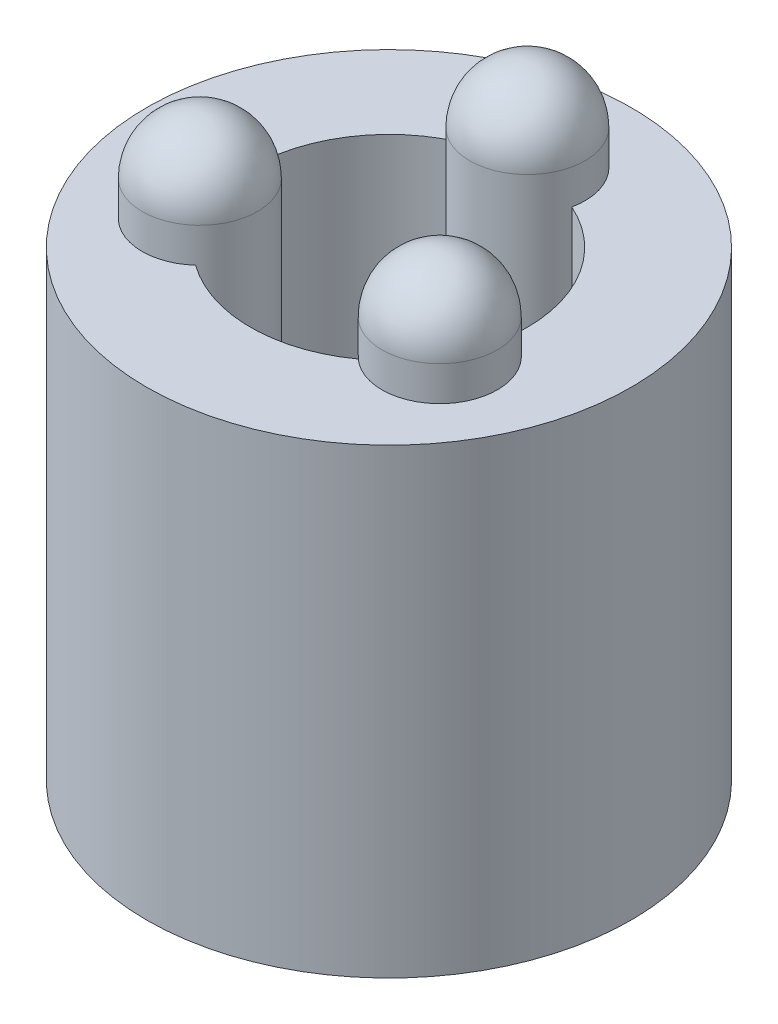
ISO-10303-21;
HEADER;
FILE_DESCRIPTION(('STEP AP214'),'2;1');
FILE_NAME('part.step','',(''),(''),'','','');
FILE_SCHEMA(('AUTOMOTIVE_DESIGN { 1 0 10303 214 1 1 1 1 }'));
ENDSEC;
DATA;
#1=APPLICATION_CONTEXT('core data for automotive mechanical design processes');
#2=APPLICATION_PROTOCOL_DEFINITION('international standard','automotive_design',2000,#1);
#3=PRODUCT_CONTEXT('',#1,'mechanical');
#4=PRODUCT('Part','Part','',(#3));
#5=PRODUCT_RELATED_PRODUCT_CATEGORY('part','',(#4));
#6=PRODUCT_DEFINITION_FORMATION('','',#4);
#7=PRODUCT_DEFINITION_CONTEXT('part definition',#1,'design');
#8=PRODUCT_DEFINITION('design','',#6,#7);
#9=PRODUCT_DEFINITION_SHAPE('','',#8);
#10=(LENGTH_UNIT() NAMED_UNIT(*) SI_UNIT(.MILLI.,.METRE.));
#11=(NAMED_UNIT(*) PLANE_ANGLE_UNIT() SI_UNIT($,.RADIAN.));
#12=(NAMED_UNIT(*) SI_UNIT($,.STERADIAN.) SOLID_ANGLE_UNIT());
#13=UNCERTAINTY_MEASURE_WITH_UNIT(LENGTH_MEASURE(1.E-05),#10,'distance_accuracy_value','');
#14=(GEOMETRIC_REPRESENTATION_CONTEXT(3) GLOBAL_UNCERTAINTY_ASSIGNED_CONTEXT((#13)) GLOBAL_UNIT_ASSIGNED_CONTEXT((#10,
#11,#12)) REPRESENTATION_CONTEXT('',''));
#15=CARTESIAN_POINT('',(0.,0.,0.));
#16=DIRECTION('',(0.,0.,1.));
#17=DIRECTION('',(1.,0.,0.));
#18=AXIS2_PLACEMENT_3D('',#15,#16,#17);
#19=CARTESIAN_POINT('',(0.,0.,0.));
#20=DIRECTION('',(0.,1.,0.));
#21=DIRECTION('',(0.,0.,1.));
#22=AXIS2_PLACEMENT_3D('',#19,#20,#21);
#23=CYLINDRICAL_SURFACE('',#22,3.);
#24=CARTESIAN_POINT('',(0.,0.,0.));
#25=DIRECTION('',(0.,1.,0.));
#26=DIRECTION('',(0.,0.,1.));
#27=AXIS2_PLACEMENT_3D('',#24,#25,#26);
#28=CIRCLE('',#27,3.);
#29=CARTESIAN_POINT('',(-1.75989861987443,0.,2.42955898215377));
#30=VERTEX_POINT('',#29);
#31=CARTESIAN_POINT('',(1.76262585540732,0.,2.42758111993186));
#32=VERTEX_POINT('',#31);
#33=EDGE_CURVE('E116',#30,#32,#28,.T.);
#34=ORIENTED_EDGE('',*,*,#33,.F.);
#35=DIRECTION('',(0.,1.,0.));
#36=VECTOR('',#35,1.);
#37=CARTESIAN_POINT('',(-1.75989861987443,6.,2.42955898215377));
#38=LINE('',#37,#36);
#39=CARTESIAN_POINT('',(-1.75989861987443,10.,2.42955898215377));
#40=VERTEX_POINT('',#39);
#41=EDGE_CURVE('E96',#30,#40,#38,.T.);
#42=ORIENTED_EDGE('',*,*,#41,.T.);
#43=CARTESIAN_POINT('',(0.,10.,0.));
#44=DIRECTION('',(0.,1.,0.));
#45=DIRECTION('',(0.,0.,1.));
#46=AXIS2_PLACEMENT_3D('',#43,#44,#45);
#47=CIRCLE('',#46,3.);
#48=CARTESIAN_POINT('',(1.76262585540732,10.,2.42758111993186));
#49=VERTEX_POINT('',#48);
#50=EDGE_CURVE('E125',#40,#49,#47,.T.);
#51=ORIENTED_EDGE('',*,*,#50,.T.);
#52=DIRECTION('',(0.,1.,0.));
#53=VECTOR('',#52,1.);
#54=CARTESIAN_POINT('',(1.76262585540732,6.,2.42758111993186));
#55=LINE('',#54,#53);
#56=EDGE_CURVE('E153',#49,#32,#55,.F.);
#57=ORIENTED_EDGE('',*,*,#56,.T.);
#58=EDGE_LOOP('',(#34,#42,#51,#57));
#59=FACE_BOUND('',#58,.T.);
#60=ADVANCED_FACE('F41',(#59),#23,.F.);
#61=CARTESIAN_POINT('',(2.98397095423433,0.,0.309705253888073));
#62=VERTEX_POINT('',#61);
#63=CARTESIAN_POINT('',(1.22257235357349,0.,-2.73958333333333));
#64=VERTEX_POINT('',#63);
#65=EDGE_CURVE('E118',#62,#64,#28,.T.);
#66=ORIENTED_EDGE('',*,*,#65,.F.);
#67=DIRECTION('',(0.,1.,0.));
#68=VECTOR('',#67,1.);
#69=CARTESIAN_POINT('',(2.98397095423433,6.,0.309705253888073));
#70=LINE('',#69,#68);
#71=CARTESIAN_POINT('',(2.98397095423433,10.,0.309705253888073));
#72=VERTEX_POINT('',#71);
#73=EDGE_CURVE('E108',#62,#72,#70,.T.);
#74=ORIENTED_EDGE('',*,*,#73,.T.);
#75=CARTESIAN_POINT('',(1.22257235357349,10.,-2.73958333333333));
#76=VERTEX_POINT('',#75);
#77=EDGE_CURVE('E126',#72,#76,#47,.T.);
#78=ORIENTED_EDGE('',*,*,#77,.T.);
#79=DIRECTION('',(0.,1.,0.));
#80=VECTOR('',#79,1.);
#81=CARTESIAN_POINT('',(1.22257235357349,6.,-2.73958333333333));
#82=LINE('',#81,#80);
#83=EDGE_CURVE('E203',#76,#64,#82,.F.);
#84=ORIENTED_EDGE('',*,*,#83,.T.);
#85=EDGE_LOOP('',(#66,#74,#78,#84));
#86=FACE_BOUND('',#85,.T.);
#87=ADVANCED_FACE('F154',(#86),#23,.F.);
#88=CARTESIAN_POINT('',(0.,10.,0.));
#89=DIRECTION('',(0.,-1.,0.));
#90=DIRECTION('',(0.,0.,-1.));
#91=AXIS2_PLACEMENT_3D('',#88,#89,#90);
#92=CYLINDRICAL_SURFACE('',#91,5.25);
#93=CARTESIAN_POINT('',(0.,10.,0.));
#94=DIRECTION('',(0.,1.,0.));
#95=DIRECTION('',(0.,0.,1.));
#96=AXIS2_PLACEMENT_3D('',#93,#94,#95);
#97=CIRCLE('',#96,5.25);
#98=CARTESIAN_POINT('',(0.,10.,5.25));
#99=VERTEX_POINT('',#98);
#100=EDGE_CURVE('E120',#99,#99,#97,.T.);
#101=ORIENTED_EDGE('',*,*,#100,.F.);
#102=EDGE_LOOP('',(#101));
#103=FACE_BOUND('',#102,.T.);
#104=CARTESIAN_POINT('',(0.,0.,0.));
#105=DIRECTION('',(0.,1.,0.));
#106=DIRECTION('',(0.,0.,1.));
#107=AXIS2_PLACEMENT_3D('',#104,#105,#106);
#108=CIRCLE('',#107,5.25);
#109=CARTESIAN_POINT('',(0.,0.,5.25));
#110=VERTEX_POINT('',#109);
#111=EDGE_CURVE('E115',#110,#110,#108,.T.);
#112=ORIENTED_EDGE('',*,*,#111,.T.);
#113=EDGE_LOOP('',(#112));
#114=FACE_BOUND('',#113,.T.);
#115=ADVANCED_FACE('F181',(#103,#114),#92,.T.);
#116=CARTESIAN_POINT('',(0.,10.,0.));
#117=DIRECTION('',(0.,1.,0.));
#118=DIRECTION('',(0.,0.,1.));
#119=AXIS2_PLACEMENT_3D('',#116,#117,#118);
#120=PLANE('',#119);
#121=CARTESIAN_POINT('',(-2.59657621135333,10.,1.50086602540376));
#122=DIRECTION('',(0.,1.,0.));
#123=DIRECTION('',(0.,0.,1.));
#124=AXIS2_PLACEMENT_3D('',#121,#122,#123);
#125=CIRCLE('',#124,1.25);
#126=CARTESIAN_POINT('',(-2.98369818894086,10.,0.31232213708128));
#127=VERTEX_POINT('',#126);
#128=EDGE_CURVE('E98',#127,#40,#125,.T.);
#129=ORIENTED_EDGE('',*,*,#128,.F.);
#130=CARTESIAN_POINT('',(-1.22257235357349,10.,-2.73958333333333));
#131=VERTEX_POINT('',#130);
#132=EDGE_CURVE('E107',#131,#127,#47,.T.);
#133=ORIENTED_EDGE('',*,*,#132,.F.);
#134=CARTESIAN_POINT('',(0.,10.,-3.));
#135=DIRECTION('',(0.,1.,0.));
#136=DIRECTION('',(0.,0.,1.));
#137=AXIS2_PLACEMENT_3D('',#134,#135,#136);
#138=CIRCLE('',#137,1.25);
#139=EDGE_CURVE('E128',#76,#131,#138,.T.);
#140=ORIENTED_EDGE('',*,*,#139,.F.);
#141=ORIENTED_EDGE('',*,*,#77,.F.);
#142=CARTESIAN_POINT('',(2.59957621135331,10.,1.49913397459623));
#143=DIRECTION('',(0.,1.,0.));
#144=DIRECTION('',(0.,0.,1.));
#145=AXIS2_PLACEMENT_3D('',#142,#143,#144);
#146=CIRCLE('',#145,1.25);
#147=EDGE_CURVE('E136',#49,#72,#146,.T.);
#148=ORIENTED_EDGE('',*,*,#147,.F.);
#149=ORIENTED_EDGE('',*,*,#50,.F.);
#150=EDGE_LOOP('',(#129,#133,#140,#141,#148,#149));
#151=FACE_BOUND('',#150,.T.);
#152=ORIENTED_EDGE('',*,*,#100,.T.);
#153=EDGE_LOOP('',(#152));
#154=FACE_BOUND('',#153,.T.);
#155=ADVANCED_FACE('F149',(#151,#154),#120,.T.);
#156=CARTESIAN_POINT('',(0.,0.,0.));
#157=DIRECTION('',(0.,1.,0.));
#158=DIRECTION('',(0.,0.,1.));
#159=AXIS2_PLACEMENT_3D('',#156,#157,#158);
#160=PLANE('',#159);
#161=CARTESIAN_POINT('',(-1.22257235357349,0.,-2.73958333333333));
#162=VERTEX_POINT('',#161);
#163=CARTESIAN_POINT('',(-2.98369818894086,0.,0.312322137081281));
#164=VERTEX_POINT('',#163);
#165=EDGE_CURVE('E105',#162,#164,#28,.T.);
#166=ORIENTED_EDGE('',*,*,#165,.T.);
#167=CARTESIAN_POINT('',(-2.59657621135333,0.,1.50086602540376));
#168=DIRECTION('',(0.,1.,0.));
#169=DIRECTION('',(0.,0.,1.));
#170=AXIS2_PLACEMENT_3D('',#167,#168,#169);
#171=CIRCLE('',#170,1.25);
#172=EDGE_CURVE('E56',#30,#164,#171,.T.);
#173=ORIENTED_EDGE('',*,*,#172,.F.);
#174=ORIENTED_EDGE('',*,*,#33,.T.);
#175=CARTESIAN_POINT('',(2.59957621135331,0.,1.49913397459623));
#176=DIRECTION('',(0.,1.,0.));
#177=DIRECTION('',(0.,0.,1.));
#178=AXIS2_PLACEMENT_3D('',#175,#176,#177);
#179=CIRCLE('',#178,1.25);
#180=EDGE_CURVE('E62',#62,#32,#179,.T.);
#181=ORIENTED_EDGE('',*,*,#180,.F.);
#182=ORIENTED_EDGE('',*,*,#65,.T.);
#183=CARTESIAN_POINT('',(0.,0.,-3.));
#184=DIRECTION('',(0.,1.,0.));
#185=DIRECTION('',(0.,0.,1.));
#186=AXIS2_PLACEMENT_3D('',#183,#184,#185);
#187=CIRCLE('',#186,1.25);
#188=EDGE_CURVE('E113',#162,#64,#187,.T.);
#189=ORIENTED_EDGE('',*,*,#188,.F.);
#190=EDGE_LOOP('',(#166,#173,#174,#181,#182,#189));
#191=FACE_BOUND('',#190,.T.);
#192=ORIENTED_EDGE('',*,*,#111,.F.);
#193=EDGE_LOOP('',(#192));
#194=FACE_BOUND('',#193,.T.);
#195=ADVANCED_FACE('F110',(#191,#194),#160,.F.);
#196=ORIENTED_EDGE('',*,*,#132,.T.);
#197=DIRECTION('',(0.,1.,0.));
#198=VECTOR('',#197,1.);
#199=CARTESIAN_POINT('',(-2.98369818894086,6.,0.312322137081281));
#200=LINE('',#199,#198);
#201=EDGE_CURVE('E93',#127,#164,#200,.F.);
#202=ORIENTED_EDGE('',*,*,#201,.T.);
#203=ORIENTED_EDGE('',*,*,#165,.F.);
#204=DIRECTION('',(0.,1.,0.));
#205=VECTOR('',#204,1.);
#206=CARTESIAN_POINT('',(-1.22257235357349,6.,-2.73958333333333));
#207=LINE('',#206,#205);
#208=EDGE_CURVE('E156',#162,#131,#207,.T.);
#209=ORIENTED_EDGE('',*,*,#208,.T.);
#210=EDGE_LOOP('',(#196,#202,#203,#209));
#211=FACE_BOUND('',#210,.T.);
#212=ADVANCED_FACE('F103',(#211),#23,.F.);
#213=CARTESIAN_POINT('',(0.,0.,-3.));
#214=DIRECTION('',(0.,1.,0.));
#215=DIRECTION('',(0.,0.,1.));
#216=AXIS2_PLACEMENT_3D('',#213,#214,#215);
#217=CYLINDRICAL_SURFACE('',#216,1.25);
#218=CARTESIAN_POINT('',(0.,10.75,-3.));
#219=DIRECTION('',(0.,1.,0.));
#220=DIRECTION('',(0.,0.,1.));
#221=AXIS2_PLACEMENT_3D('',#218,#219,#220);
#222=CIRCLE('',#221,1.25);
#223=CARTESIAN_POINT('',(0.,10.75,-1.75));
#224=VERTEX_POINT('',#223);
#225=EDGE_CURVE('E146',#224,#224,#222,.F.);
#226=ORIENTED_EDGE('',*,*,#225,.T.);
#227=EDGE_LOOP('',(#226));
#228=FACE_BOUND('',#227,.T.);
#229=ORIENTED_EDGE('',*,*,#208,.F.);
#230=ORIENTED_EDGE('',*,*,#188,.T.);
#231=ORIENTED_EDGE('',*,*,#83,.F.);
#232=ORIENTED_EDGE('',*,*,#139,.T.);
#233=EDGE_LOOP('',(#229,#230,#231,#232));
#234=FACE_BOUND('',#233,.T.);
#235=ADVANCED_FACE('F185',(#228,#234),#217,.T.);
#236=CARTESIAN_POINT('',(2.59957621135331,0.,1.49913397459623));
#237=DIRECTION('',(0.,1.,0.));
#238=DIRECTION('',(0.,0.,1.));
#239=AXIS2_PLACEMENT_3D('',#236,#237,#238);
#240=CYLINDRICAL_SURFACE('',#239,1.25);
#241=CARTESIAN_POINT('',(2.59957621135331,10.75,1.49913397459623));
#242=DIRECTION('',(0.,1.,0.));
#243=DIRECTION('',(0.,0.,1.));
#244=AXIS2_PLACEMENT_3D('',#241,#242,#243);
#245=CIRCLE('',#244,1.25);
#246=CARTESIAN_POINT('',(2.59957621135331,10.75,2.74913397459623));
#247=VERTEX_POINT('',#246);
#248=EDGE_CURVE('E49',#247,#247,#245,.F.);
#249=ORIENTED_EDGE('',*,*,#248,.T.);
#250=EDGE_LOOP('',(#249));
#251=FACE_BOUND('',#250,.T.);
#252=ORIENTED_EDGE('',*,*,#73,.F.);
#253=ORIENTED_EDGE('',*,*,#180,.T.);
#254=ORIENTED_EDGE('',*,*,#56,.F.);
#255=ORIENTED_EDGE('',*,*,#147,.T.);
#256=EDGE_LOOP('',(#252,#253,#254,#255));
#257=FACE_BOUND('',#256,.T.);
#258=ADVANCED_FACE('F152',(#251,#257),#240,.T.);
#259=CARTESIAN_POINT('',(-2.59657621135333,0.,1.50086602540376));
#260=DIRECTION('',(0.,1.,0.));
#261=DIRECTION('',(0.,0.,1.));
#262=AXIS2_PLACEMENT_3D('',#259,#260,#261);
#263=CYLINDRICAL_SURFACE('',#262,1.25);
#264=CARTESIAN_POINT('',(-2.59657621135333,10.75,1.50086602540376));
#265=DIRECTION('',(0.,1.,0.));
#266=DIRECTION('',(0.,0.,1.));
#267=AXIS2_PLACEMENT_3D('',#264,#265,#266);
#268=CIRCLE('',#267,1.25);
#269=CARTESIAN_POINT('',(-2.59657621135333,10.75,2.75086602540376));
#270=VERTEX_POINT('',#269);
#271=EDGE_CURVE('E11',#270,#270,#268,.F.);
#272=ORIENTED_EDGE('',*,*,#271,.T.);
#273=EDGE_LOOP('',(#272));
#274=FACE_BOUND('',#273,.T.);
#275=ORIENTED_EDGE('',*,*,#41,.F.);
#276=ORIENTED_EDGE('',*,*,#172,.T.);
#277=ORIENTED_EDGE('',*,*,#201,.F.);
#278=ORIENTED_EDGE('',*,*,#128,.T.);
#279=EDGE_LOOP('',(#275,#276,#277,#278));
#280=FACE_BOUND('',#279,.T.);
#281=ADVANCED_FACE('F92',(#274,#280),#263,.T.);
#282=CARTESIAN_POINT('',(0.,10.75,-3.));
#283=DIRECTION('',(0.,1.,0.));
#284=DIRECTION('',(0.,0.,1.));
#285=AXIS2_PLACEMENT_3D('',#282,#283,#284);
#286=SPHERICAL_SURFACE('',#285,1.25);
#287=ORIENTED_EDGE('',*,*,#225,.F.);
#288=EDGE_LOOP('',(#287));
#289=FACE_BOUND('',#288,.T.);
#290=ADVANCED_FACE('F167',(#289),#286,.T.);
#291=CARTESIAN_POINT('',(2.59957621135331,10.75,1.49913397459623));
#292=DIRECTION('',(0.,1.,0.));
#293=DIRECTION('',(0.,0.,1.));
#294=AXIS2_PLACEMENT_3D('',#291,#292,#293);
#295=SPHERICAL_SURFACE('',#294,1.25);
#296=ORIENTED_EDGE('',*,*,#248,.F.);
#297=EDGE_LOOP('',(#296));
#298=FACE_BOUND('',#297,.T.);
#299=ADVANCED_FACE('F165',(#298),#295,.T.);
#300=CARTESIAN_POINT('',(-2.59657621135333,10.75,1.50086602540376));
#301=DIRECTION('',(0.,1.,0.));
#302=DIRECTION('',(0.,0.,1.));
#303=AXIS2_PLACEMENT_3D('',#300,#301,#302);
#304=SPHERICAL_SURFACE('',#303,1.25);
#305=ORIENTED_EDGE('',*,*,#271,.F.);
#306=EDGE_LOOP('',(#305));
#307=FACE_BOUND('',#306,.T.);
#308=ADVANCED_FACE('F43',(#307),#304,.T.);
#309=CLOSED_SHELL('',(#60,#87,#115,#155,#195,#212,#235,#258,#281,#290,#299,#308));
#310=MANIFOLD_SOLID_BREP('B2',#309);
#311=ADVANCED_BREP_SHAPE_REPRESENTATION('',(#18,#310),#14);
#312=SHAPE_DEFINITION_REPRESENTATION(#9,#311);
ENDSEC;
END-ISO-10303-21;
